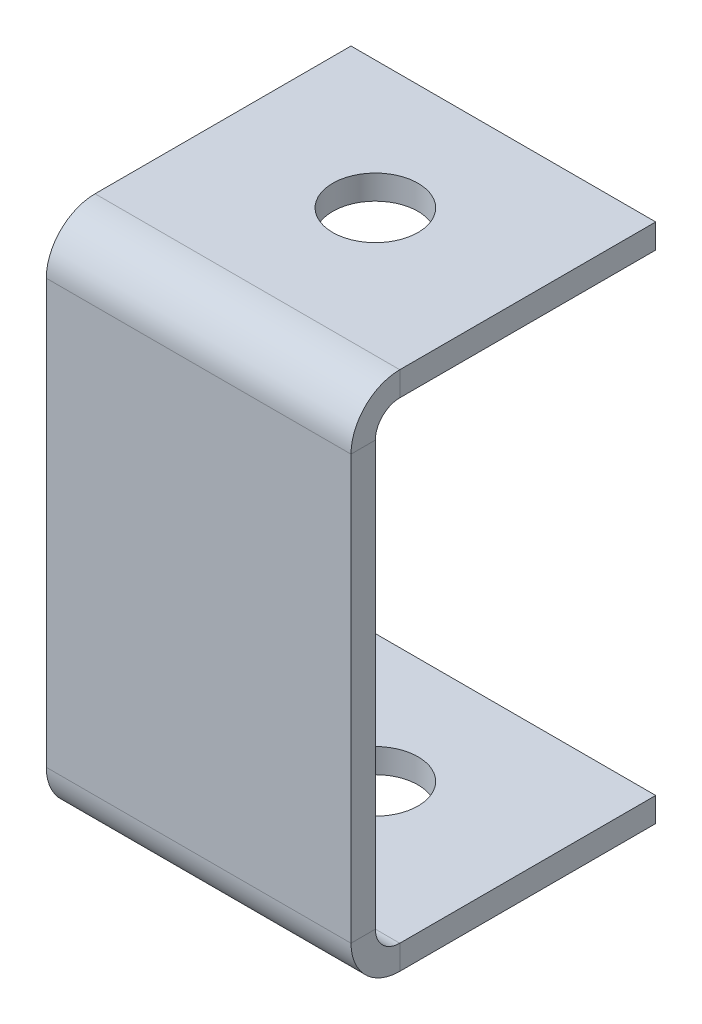
ISO-10303-21;
HEADER;
FILE_DESCRIPTION(('STEP AP214'),'2;1');
FILE_NAME('part.step','',(''),(''),'','','');
FILE_SCHEMA(('AUTOMOTIVE_DESIGN { 1 0 10303 214 1 1 1 1 }'));
ENDSEC;
DATA;
#1=APPLICATION_CONTEXT('core data for automotive mechanical design processes');
#2=APPLICATION_PROTOCOL_DEFINITION('international standard','automotive_design',2000,#1);
#3=PRODUCT_CONTEXT('',#1,'mechanical');
#4=PRODUCT('Part','Part','',(#3));
#5=PRODUCT_RELATED_PRODUCT_CATEGORY('part','',(#4));
#6=PRODUCT_DEFINITION_FORMATION('','',#4);
#7=PRODUCT_DEFINITION_CONTEXT('part definition',#1,'design');
#8=PRODUCT_DEFINITION('design','',#6,#7);
#9=PRODUCT_DEFINITION_SHAPE('','',#8);
#10=(LENGTH_UNIT() NAMED_UNIT(*) SI_UNIT(.MILLI.,.METRE.));
#11=(NAMED_UNIT(*) PLANE_ANGLE_UNIT() SI_UNIT($,.RADIAN.));
#12=(NAMED_UNIT(*) SI_UNIT($,.STERADIAN.) SOLID_ANGLE_UNIT());
#13=UNCERTAINTY_MEASURE_WITH_UNIT(LENGTH_MEASURE(1.E-05),#10,'distance_accuracy_value','');
#14=(GEOMETRIC_REPRESENTATION_CONTEXT(3) GLOBAL_UNCERTAINTY_ASSIGNED_CONTEXT((#13)) GLOBAL_UNIT_ASSIGNED_CONTEXT((#10,
#11,#12)) REPRESENTATION_CONTEXT('',''));
#15=CARTESIAN_POINT('',(0.,0.,0.));
#16=DIRECTION('',(0.,0.,1.));
#17=DIRECTION('',(1.,0.,0.));
#18=AXIS2_PLACEMENT_3D('',#15,#16,#17);
#19=CARTESIAN_POINT('',(0.,0.,-2.));
#20=DIRECTION('',(0.,0.,1.));
#21=DIRECTION('',(1.,0.,0.));
#22=AXIS2_PLACEMENT_3D('',#19,#20,#21);
#23=PLANE('',#22);
#24=DIRECTION('',(1.,0.,0.));
#25=VECTOR('',#24,1.);
#26=CARTESIAN_POINT('',(12.5,17.375,-1.99999999999999));
#27=LINE('',#26,#25);
#28=CARTESIAN_POINT('',(12.5,17.375,-1.99999999999999));
#29=VERTEX_POINT('',#28);
#30=CARTESIAN_POINT('',(-12.5,17.375,-1.99999999999999));
#31=VERTEX_POINT('',#30);
#32=EDGE_CURVE('E326',#29,#31,#27,.F.);
#33=ORIENTED_EDGE('',*,*,#32,.F.);
#34=DIRECTION('',(0.,1.,0.));
#35=VECTOR('',#34,1.);
#36=CARTESIAN_POINT('',(12.5,-21.375,-2.));
#37=LINE('',#36,#35);
#38=CARTESIAN_POINT('',(12.5,-17.375,-1.99999999999999));
#39=VERTEX_POINT('',#38);
#40=EDGE_CURVE('E13',#39,#29,#37,.T.);
#41=ORIENTED_EDGE('',*,*,#40,.F.);
#42=DIRECTION('',(-1.,0.,0.));
#43=VECTOR('',#42,1.);
#44=CARTESIAN_POINT('',(-12.5,-17.375,-1.99999999999999));
#45=LINE('',#44,#43);
#46=CARTESIAN_POINT('',(-12.5,-17.375,-1.99999999999999));
#47=VERTEX_POINT('',#46);
#48=EDGE_CURVE('E146',#47,#39,#45,.F.);
#49=ORIENTED_EDGE('',*,*,#48,.F.);
#50=DIRECTION('',(0.,-1.,0.));
#51=VECTOR('',#50,1.);
#52=CARTESIAN_POINT('',(-12.5,-21.375,-2.));
#53=LINE('',#52,#51);
#54=EDGE_CURVE('E87',#31,#47,#53,.T.);
#55=ORIENTED_EDGE('',*,*,#54,.F.);
#56=EDGE_LOOP('',(#33,#41,#49,#55));
#57=FACE_BOUND('',#56,.T.);
#58=ADVANCED_FACE('F78',(#57),#23,.F.);
#59=CARTESIAN_POINT('',(0.,0.,0.));
#60=DIRECTION('',(0.,0.,1.));
#61=DIRECTION('',(1.,0.,0.));
#62=AXIS2_PLACEMENT_3D('',#59,#60,#61);
#63=PLANE('',#62);
#64=DIRECTION('',(0.,1.,0.));
#65=VECTOR('',#64,1.);
#66=CARTESIAN_POINT('',(12.5,-21.375,0.));
#67=LINE('',#66,#65);
#68=CARTESIAN_POINT('',(12.5,-17.375,0.));
#69=VERTEX_POINT('',#68);
#70=CARTESIAN_POINT('',(12.5,17.375,0.));
#71=VERTEX_POINT('',#70);
#72=EDGE_CURVE('E82',#69,#71,#67,.T.);
#73=ORIENTED_EDGE('',*,*,#72,.T.);
#74=DIRECTION('',(1.,0.,0.));
#75=VECTOR('',#74,1.);
#76=CARTESIAN_POINT('',(12.5,17.375,0.));
#77=LINE('',#76,#75);
#78=CARTESIAN_POINT('',(-12.5,17.375,0.));
#79=VERTEX_POINT('',#78);
#80=EDGE_CURVE('E189',#71,#79,#77,.F.);
#81=ORIENTED_EDGE('',*,*,#80,.T.);
#82=DIRECTION('',(0.,-1.,0.));
#83=VECTOR('',#82,1.);
#84=CARTESIAN_POINT('',(-12.5,-21.375,0.));
#85=LINE('',#84,#83);
#86=CARTESIAN_POINT('',(-12.5,-17.375,0.));
#87=VERTEX_POINT('',#86);
#88=EDGE_CURVE('E104',#79,#87,#85,.T.);
#89=ORIENTED_EDGE('',*,*,#88,.T.);
#90=DIRECTION('',(-1.,0.,0.));
#91=VECTOR('',#90,1.);
#92=CARTESIAN_POINT('',(-12.5,-17.375,0.));
#93=LINE('',#92,#91);
#94=EDGE_CURVE('E173',#87,#69,#93,.F.);
#95=ORIENTED_EDGE('',*,*,#94,.T.);
#96=EDGE_LOOP('',(#73,#81,#89,#95));
#97=FACE_BOUND('',#96,.T.);
#98=ADVANCED_FACE('F186',(#97),#63,.T.);
#99=CARTESIAN_POINT('',(12.5,-21.375,-2.));
#100=DIRECTION('',(1.,0.,0.));
#101=DIRECTION('',(0.,0.,-1.));
#102=AXIS2_PLACEMENT_3D('',#99,#100,#101);
#103=PLANE('',#102);
#104=ORIENTED_EDGE('',*,*,#40,.T.);
#105=DIRECTION('',(0.,0.,1.));
#106=VECTOR('',#105,1.);
#107=CARTESIAN_POINT('',(12.5,17.375,-1.99999999999999));
#108=LINE('',#107,#106);
#109=EDGE_CURVE('E198',#29,#71,#108,.T.);
#110=ORIENTED_EDGE('',*,*,#109,.T.);
#111=ORIENTED_EDGE('',*,*,#72,.F.);
#112=DIRECTION('',(0.,0.,1.));
#113=VECTOR('',#112,1.);
#114=CARTESIAN_POINT('',(12.5,-17.375,-1.99999999999999));
#115=LINE('',#114,#113);
#116=EDGE_CURVE('E180',#39,#69,#115,.T.);
#117=ORIENTED_EDGE('',*,*,#116,.F.);
#118=EDGE_LOOP('',(#104,#110,#111,#117));
#119=FACE_BOUND('',#118,.T.);
#120=ADVANCED_FACE('F195',(#119),#103,.T.);
#121=CARTESIAN_POINT('',(-12.5,-21.375,-2.));
#122=DIRECTION('',(-1.,0.,0.));
#123=DIRECTION('',(0.,0.,1.));
#124=AXIS2_PLACEMENT_3D('',#121,#122,#123);
#125=PLANE('',#124);
#126=DIRECTION('',(0.,0.,1.));
#127=VECTOR('',#126,1.);
#128=CARTESIAN_POINT('',(-12.5,17.375,-1.99999999999999));
#129=LINE('',#128,#127);
#130=EDGE_CURVE('E204',#31,#79,#129,.T.);
#131=ORIENTED_EDGE('',*,*,#130,.F.);
#132=ORIENTED_EDGE('',*,*,#54,.T.);
#133=DIRECTION('',(0.,0.,1.));
#134=VECTOR('',#133,1.);
#135=CARTESIAN_POINT('',(-12.5,-17.375,-1.99999999999999));
#136=LINE('',#135,#134);
#137=EDGE_CURVE('E145',#47,#87,#136,.T.);
#138=ORIENTED_EDGE('',*,*,#137,.T.);
#139=ORIENTED_EDGE('',*,*,#88,.F.);
#140=EDGE_LOOP('',(#131,#132,#138,#139));
#141=FACE_BOUND('',#140,.T.);
#142=ADVANCED_FACE('F80',(#141),#125,.T.);
#143=CARTESIAN_POINT('',(12.5,-17.375,-4.));
#144=DIRECTION('',(1.,0.,0.));
#145=DIRECTION('',(0.,0.,-1.));
#146=AXIS2_PLACEMENT_3D('',#143,#144,#145);
#147=PLANE('',#146);
#148=DIRECTION('',(0.,-1.,0.));
#149=VECTOR('',#148,1.);
#150=CARTESIAN_POINT('',(12.5,-21.375,-3.99999999999998));
#151=LINE('',#150,#149);
#152=CARTESIAN_POINT('',(12.5,-19.375,-3.99999999999999));
#153=VERTEX_POINT('',#152);
#154=CARTESIAN_POINT('',(12.5,-21.375,-3.99999999999998));
#155=VERTEX_POINT('',#154);
#156=EDGE_CURVE('E135',#153,#155,#151,.T.);
#157=ORIENTED_EDGE('',*,*,#156,.F.);
#158=CARTESIAN_POINT('',(12.5,-17.375,-4.));
#159=DIRECTION('',(-1.,0.,0.));
#160=DIRECTION('',(0.,0.,1.));
#161=AXIS2_PLACEMENT_3D('',#158,#159,#160);
#162=CIRCLE('',#161,2.);
#163=EDGE_CURVE('E129',#39,#153,#162,.F.);
#164=ORIENTED_EDGE('',*,*,#163,.F.);
#165=ORIENTED_EDGE('',*,*,#116,.T.);
#166=CARTESIAN_POINT('',(12.5,-17.375,-4.));
#167=DIRECTION('',(-1.,0.,0.));
#168=DIRECTION('',(0.,0.,1.));
#169=AXIS2_PLACEMENT_3D('',#166,#167,#168);
#170=CIRCLE('',#169,4.);
#171=EDGE_CURVE('E95',#69,#155,#170,.F.);
#172=ORIENTED_EDGE('',*,*,#171,.T.);
#173=EDGE_LOOP('',(#157,#164,#165,#172));
#174=FACE_BOUND('',#173,.T.);
#175=ADVANCED_FACE('F368',(#174),#147,.T.);
#176=CARTESIAN_POINT('',(-12.5,-17.375,-4.));
#177=DIRECTION('',(1.,0.,0.));
#178=DIRECTION('',(0.,0.,-1.));
#179=AXIS2_PLACEMENT_3D('',#176,#177,#178);
#180=PLANE('',#179);
#181=CARTESIAN_POINT('',(-12.5,-17.375,-4.));
#182=DIRECTION('',(-1.,0.,0.));
#183=DIRECTION('',(0.,0.,1.));
#184=AXIS2_PLACEMENT_3D('',#181,#182,#183);
#185=CIRCLE('',#184,2.);
#186=CARTESIAN_POINT('',(-12.5,-19.375,-3.99999999999999));
#187=VERTEX_POINT('',#186);
#188=EDGE_CURVE('E126',#187,#47,#185,.T.);
#189=ORIENTED_EDGE('',*,*,#188,.F.);
#190=DIRECTION('',(0.,-1.,0.));
#191=VECTOR('',#190,1.);
#192=CARTESIAN_POINT('',(-12.5,-19.375,-3.99999999999999));
#193=LINE('',#192,#191);
#194=CARTESIAN_POINT('',(-12.5,-21.375,-3.99999999999998));
#195=VERTEX_POINT('',#194);
#196=EDGE_CURVE('E134',#187,#195,#193,.T.);
#197=ORIENTED_EDGE('',*,*,#196,.T.);
#198=CARTESIAN_POINT('',(-12.5,-17.375,-4.));
#199=DIRECTION('',(-1.,0.,0.));
#200=DIRECTION('',(0.,0.,1.));
#201=AXIS2_PLACEMENT_3D('',#198,#199,#200);
#202=CIRCLE('',#201,4.);
#203=EDGE_CURVE('E175',#195,#87,#202,.T.);
#204=ORIENTED_EDGE('',*,*,#203,.T.);
#205=ORIENTED_EDGE('',*,*,#137,.F.);
#206=EDGE_LOOP('',(#189,#197,#204,#205));
#207=FACE_BOUND('',#206,.T.);
#208=ADVANCED_FACE('F140',(#207),#180,.F.);
#209=CARTESIAN_POINT('',(-12.5,-17.375,-4.));
#210=DIRECTION('',(-1.,0.,0.));
#211=DIRECTION('',(0.,-1.,0.));
#212=AXIS2_PLACEMENT_3D('',#209,#210,#211);
#213=CYLINDRICAL_SURFACE('',#212,4.);
#214=ORIENTED_EDGE('',*,*,#94,.F.);
#215=ORIENTED_EDGE('',*,*,#203,.F.);
#216=DIRECTION('',(-1.,0.,0.));
#217=VECTOR('',#216,1.);
#218=CARTESIAN_POINT('',(0.,-21.375,-3.99999999999998));
#219=LINE('',#218,#217);
#220=EDGE_CURVE('E164',#155,#195,#219,.T.);
#221=ORIENTED_EDGE('',*,*,#220,.F.);
#222=ORIENTED_EDGE('',*,*,#171,.F.);
#223=EDGE_LOOP('',(#214,#215,#221,#222));
#224=FACE_BOUND('',#223,.T.);
#225=ADVANCED_FACE('F380',(#224),#213,.T.);
#226=CARTESIAN_POINT('',(-12.5,-17.375,-4.));
#227=DIRECTION('',(-1.,0.,0.));
#228=DIRECTION('',(0.,-1.,0.));
#229=AXIS2_PLACEMENT_3D('',#226,#227,#228);
#230=CYLINDRICAL_SURFACE('',#229,2.);
#231=ORIENTED_EDGE('',*,*,#48,.T.);
#232=ORIENTED_EDGE('',*,*,#163,.T.);
#233=DIRECTION('',(1.,0.,0.));
#234=VECTOR('',#233,1.);
#235=CARTESIAN_POINT('',(12.5,-19.375,-3.99999999999999));
#236=LINE('',#235,#234);
#237=EDGE_CURVE('E123',#153,#187,#236,.F.);
#238=ORIENTED_EDGE('',*,*,#237,.T.);
#239=ORIENTED_EDGE('',*,*,#188,.T.);
#240=EDGE_LOOP('',(#231,#232,#238,#239));
#241=FACE_BOUND('',#240,.T.);
#242=ADVANCED_FACE('F125',(#241),#230,.F.);
#243=CARTESIAN_POINT('',(-12.5,-21.375,-1.99999999999999));
#244=DIRECTION('',(-1.,0.,0.));
#245=DIRECTION('',(0.,0.,1.));
#246=AXIS2_PLACEMENT_3D('',#243,#244,#245);
#247=PLANE('',#246);
#248=DIRECTION('',(0.,0.,1.));
#249=VECTOR('',#248,1.);
#250=CARTESIAN_POINT('',(-12.5,-21.375,-1.99999999999999));
#251=LINE('',#250,#249);
#252=CARTESIAN_POINT('',(-12.5,-21.3750000000001,-25.));
#253=VERTEX_POINT('',#252);
#254=EDGE_CURVE('E163',#253,#195,#251,.T.);
#255=ORIENTED_EDGE('',*,*,#254,.T.);
#256=ORIENTED_EDGE('',*,*,#196,.F.);
#257=DIRECTION('',(0.,0.,-1.));
#258=VECTOR('',#257,1.);
#259=CARTESIAN_POINT('',(-12.5,-19.375,0.));
#260=LINE('',#259,#258);
#261=CARTESIAN_POINT('',(-12.5,-19.3750000000001,-25.));
#262=VERTEX_POINT('',#261);
#263=EDGE_CURVE('E151',#262,#187,#260,.F.);
#264=ORIENTED_EDGE('',*,*,#263,.F.);
#265=DIRECTION('',(0.,1.,0.));
#266=VECTOR('',#265,1.);
#267=CARTESIAN_POINT('',(-12.5,-21.3750000000001,-25.));
#268=LINE('',#267,#266);
#269=EDGE_CURVE('E147',#253,#262,#268,.T.);
#270=ORIENTED_EDGE('',*,*,#269,.F.);
#271=EDGE_LOOP('',(#255,#256,#264,#270));
#272=FACE_BOUND('',#271,.T.);
#273=ADVANCED_FACE('F161',(#272),#247,.T.);
#274=CARTESIAN_POINT('',(12.5,-21.3750000000001,-25.));
#275=DIRECTION('',(1.,0.,0.));
#276=DIRECTION('',(0.,0.,-1.));
#277=AXIS2_PLACEMENT_3D('',#274,#275,#276);
#278=PLANE('',#277);
#279=DIRECTION('',(0.,0.,1.));
#280=VECTOR('',#279,1.);
#281=CARTESIAN_POINT('',(12.5,-19.375,0.));
#282=LINE('',#281,#280);
#283=CARTESIAN_POINT('',(12.5,-19.3750000000001,-25.));
#284=VERTEX_POINT('',#283);
#285=EDGE_CURVE('E166',#153,#284,#282,.F.);
#286=ORIENTED_EDGE('',*,*,#285,.F.);
#287=ORIENTED_EDGE('',*,*,#156,.T.);
#288=DIRECTION('',(0.,0.,-1.));
#289=VECTOR('',#288,1.);
#290=CARTESIAN_POINT('',(12.5,-21.3750000000001,-25.));
#291=LINE('',#290,#289);
#292=CARTESIAN_POINT('',(12.5,-21.3750000000001,-25.));
#293=VERTEX_POINT('',#292);
#294=EDGE_CURVE('E158',#155,#293,#291,.T.);
#295=ORIENTED_EDGE('',*,*,#294,.T.);
#296=DIRECTION('',(0.,1.,0.));
#297=VECTOR('',#296,1.);
#298=CARTESIAN_POINT('',(12.5,-21.3750000000001,-25.));
#299=LINE('',#298,#297);
#300=EDGE_CURVE('E220',#293,#284,#299,.T.);
#301=ORIENTED_EDGE('',*,*,#300,.T.);
#302=EDGE_LOOP('',(#286,#287,#295,#301));
#303=FACE_BOUND('',#302,.T.);
#304=ADVANCED_FACE('F232',(#303),#278,.T.);
#305=CARTESIAN_POINT('',(0.,-21.375,0.));
#306=DIRECTION('',(0.,-1.,0.));
#307=DIRECTION('',(0.,0.,-1.));
#308=AXIS2_PLACEMENT_3D('',#305,#306,#307);
#309=PLANE('',#308);
#310=CARTESIAN_POINT('',(0.,-21.3750000000001,-14.5));
#311=DIRECTION('',(0.,1.,0.));
#312=DIRECTION('',(0.,0.,1.));
#313=AXIS2_PLACEMENT_3D('',#310,#311,#312);
#314=CIRCLE('',#313,3.5);
#315=CARTESIAN_POINT('',(0.,-21.3750000000001,-11.));
#316=VERTEX_POINT('',#315);
#317=EDGE_CURVE('E172',#316,#316,#314,.T.);
#318=ORIENTED_EDGE('',*,*,#317,.T.);
#319=EDGE_LOOP('',(#318));
#320=FACE_BOUND('',#319,.T.);
#321=ORIENTED_EDGE('',*,*,#294,.F.);
#322=ORIENTED_EDGE('',*,*,#220,.T.);
#323=ORIENTED_EDGE('',*,*,#254,.F.);
#324=DIRECTION('',(-1.,0.,0.));
#325=VECTOR('',#324,1.);
#326=CARTESIAN_POINT('',(-12.5,-21.3750000000001,-25.));
#327=LINE('',#326,#325);
#328=EDGE_CURVE('E224',#293,#253,#327,.T.);
#329=ORIENTED_EDGE('',*,*,#328,.F.);
#330=EDGE_LOOP('',(#321,#322,#323,#329));
#331=FACE_BOUND('',#330,.T.);
#332=ADVANCED_FACE('F379',(#320,#331),#309,.T.);
#333=CARTESIAN_POINT('',(0.,-19.375,0.));
#334=DIRECTION('',(0.,-1.,0.));
#335=DIRECTION('',(0.,0.,-1.));
#336=AXIS2_PLACEMENT_3D('',#333,#334,#335);
#337=PLANE('',#336);
#338=CARTESIAN_POINT('',(0.,-19.375,-14.5));
#339=DIRECTION('',(0.,1.,0.));
#340=DIRECTION('',(0.,0.,1.));
#341=AXIS2_PLACEMENT_3D('',#338,#339,#340);
#342=CIRCLE('',#341,3.5);
#343=CARTESIAN_POINT('',(0.,-19.375,-11.));
#344=VERTEX_POINT('',#343);
#345=EDGE_CURVE('E208',#344,#344,#342,.T.);
#346=ORIENTED_EDGE('',*,*,#345,.F.);
#347=EDGE_LOOP('',(#346));
#348=FACE_BOUND('',#347,.T.);
#349=ORIENTED_EDGE('',*,*,#237,.F.);
#350=ORIENTED_EDGE('',*,*,#285,.T.);
#351=DIRECTION('',(1.,0.,0.));
#352=VECTOR('',#351,1.);
#353=CARTESIAN_POINT('',(0.,-19.3750000000001,-25.));
#354=LINE('',#353,#352);
#355=EDGE_CURVE('E155',#284,#262,#354,.F.);
#356=ORIENTED_EDGE('',*,*,#355,.T.);
#357=ORIENTED_EDGE('',*,*,#263,.T.);
#358=EDGE_LOOP('',(#349,#350,#356,#357));
#359=FACE_BOUND('',#358,.T.);
#360=ADVANCED_FACE('F152',(#348,#359),#337,.F.);
#361=CARTESIAN_POINT('',(-12.5,-21.3750000000001,-25.));
#362=DIRECTION('',(0.,0.,-1.));
#363=DIRECTION('',(0.,1.,0.));
#364=AXIS2_PLACEMENT_3D('',#361,#362,#363);
#365=PLANE('',#364);
#366=ORIENTED_EDGE('',*,*,#355,.F.);
#367=ORIENTED_EDGE('',*,*,#300,.F.);
#368=ORIENTED_EDGE('',*,*,#328,.T.);
#369=ORIENTED_EDGE('',*,*,#269,.T.);
#370=EDGE_LOOP('',(#366,#367,#368,#369));
#371=FACE_BOUND('',#370,.T.);
#372=ADVANCED_FACE('F237',(#371),#365,.T.);
#373=CARTESIAN_POINT('',(0.,-21.3750000000001,-14.5));
#374=DIRECTION('',(0.,1.,0.));
#375=DIRECTION('',(0.,0.,1.));
#376=AXIS2_PLACEMENT_3D('',#373,#374,#375);
#377=CYLINDRICAL_SURFACE('',#376,3.5);
#378=ORIENTED_EDGE('',*,*,#317,.F.);
#379=EDGE_LOOP('',(#378));
#380=FACE_BOUND('',#379,.T.);
#381=ORIENTED_EDGE('',*,*,#345,.T.);
#382=EDGE_LOOP('',(#381));
#383=FACE_BOUND('',#382,.T.);
#384=ADVANCED_FACE('F393',(#380,#383),#377,.F.);
#385=CARTESIAN_POINT('',(-12.5,17.375,-4.));
#386=DIRECTION('',(-1.,0.,0.));
#387=DIRECTION('',(0.,0.,1.));
#388=AXIS2_PLACEMENT_3D('',#385,#386,#387);
#389=PLANE('',#388);
#390=DIRECTION('',(0.,-1.,0.));
#391=VECTOR('',#390,1.);
#392=CARTESIAN_POINT('',(-12.5,21.375,-3.99999999999998));
#393=LINE('',#392,#391);
#394=CARTESIAN_POINT('',(-12.5,19.375,-3.99999999999999));
#395=VERTEX_POINT('',#394);
#396=CARTESIAN_POINT('',(-12.5,21.375,-3.99999999999998));
#397=VERTEX_POINT('',#396);
#398=EDGE_CURVE('E319',#395,#397,#393,.F.);
#399=ORIENTED_EDGE('',*,*,#398,.F.);
#400=CARTESIAN_POINT('',(-12.5,17.375,-4.));
#401=DIRECTION('',(1.,0.,0.));
#402=DIRECTION('',(0.,0.,-1.));
#403=AXIS2_PLACEMENT_3D('',#400,#401,#402);
#404=CIRCLE('',#403,2.);
#405=EDGE_CURVE('E279',#31,#395,#404,.F.);
#406=ORIENTED_EDGE('',*,*,#405,.F.);
#407=ORIENTED_EDGE('',*,*,#130,.T.);
#408=CARTESIAN_POINT('',(-12.5,17.375,-4.));
#409=DIRECTION('',(1.,0.,0.));
#410=DIRECTION('',(0.,0.,-1.));
#411=AXIS2_PLACEMENT_3D('',#408,#409,#410);
#412=CIRCLE('',#411,4.);
#413=EDGE_CURVE('E205',#79,#397,#412,.F.);
#414=ORIENTED_EDGE('',*,*,#413,.T.);
#415=EDGE_LOOP('',(#399,#406,#407,#414));
#416=FACE_BOUND('',#415,.T.);
#417=ADVANCED_FACE('F404',(#416),#389,.T.);
#418=CARTESIAN_POINT('',(12.5,17.375,-4.));
#419=DIRECTION('',(-1.,0.,0.));
#420=DIRECTION('',(0.,0.,1.));
#421=AXIS2_PLACEMENT_3D('',#418,#419,#420);
#422=PLANE('',#421);
#423=CARTESIAN_POINT('',(12.5,17.375,-4.));
#424=DIRECTION('',(1.,0.,0.));
#425=DIRECTION('',(0.,0.,-1.));
#426=AXIS2_PLACEMENT_3D('',#423,#424,#425);
#427=CIRCLE('',#426,2.);
#428=CARTESIAN_POINT('',(12.5,19.375,-3.99999999999999));
#429=VERTEX_POINT('',#428);
#430=EDGE_CURVE('E284',#429,#29,#427,.T.);
#431=ORIENTED_EDGE('',*,*,#430,.F.);
#432=DIRECTION('',(0.,-1.,0.));
#433=VECTOR('',#432,1.);
#434=CARTESIAN_POINT('',(12.5,19.375,-3.99999999999999));
#435=LINE('',#434,#433);
#436=CARTESIAN_POINT('',(12.5,21.375,-3.99999999999998));
#437=VERTEX_POINT('',#436);
#438=EDGE_CURVE('E282',#429,#437,#435,.F.);
#439=ORIENTED_EDGE('',*,*,#438,.T.);
#440=CARTESIAN_POINT('',(12.5,17.375,-4.));
#441=DIRECTION('',(1.,0.,0.));
#442=DIRECTION('',(0.,0.,-1.));
#443=AXIS2_PLACEMENT_3D('',#440,#441,#442);
#444=CIRCLE('',#443,4.);
#445=EDGE_CURVE('E274',#437,#71,#444,.T.);
#446=ORIENTED_EDGE('',*,*,#445,.T.);
#447=ORIENTED_EDGE('',*,*,#109,.F.);
#448=EDGE_LOOP('',(#431,#439,#446,#447));
#449=FACE_BOUND('',#448,.T.);
#450=ADVANCED_FACE('F283',(#449),#422,.F.);
#451=CARTESIAN_POINT('',(12.5,17.375,-4.));
#452=DIRECTION('',(1.,0.,0.));
#453=DIRECTION('',(0.,1.,0.));
#454=AXIS2_PLACEMENT_3D('',#451,#452,#453);
#455=CYLINDRICAL_SURFACE('',#454,4.);
#456=ORIENTED_EDGE('',*,*,#80,.F.);
#457=ORIENTED_EDGE('',*,*,#445,.F.);
#458=DIRECTION('',(1.,0.,0.));
#459=VECTOR('',#458,1.);
#460=CARTESIAN_POINT('',(0.,21.375,-3.99999999999998));
#461=LINE('',#460,#459);
#462=EDGE_CURVE('E278',#397,#437,#461,.T.);
#463=ORIENTED_EDGE('',*,*,#462,.F.);
#464=ORIENTED_EDGE('',*,*,#413,.F.);
#465=EDGE_LOOP('',(#456,#457,#463,#464));
#466=FACE_BOUND('',#465,.T.);
#467=ADVANCED_FACE('F276',(#466),#455,.T.);
#468=CARTESIAN_POINT('',(12.5,17.375,-4.));
#469=DIRECTION('',(1.,0.,0.));
#470=DIRECTION('',(0.,1.,0.));
#471=AXIS2_PLACEMENT_3D('',#468,#469,#470);
#472=CYLINDRICAL_SURFACE('',#471,2.);
#473=ORIENTED_EDGE('',*,*,#32,.T.);
#474=ORIENTED_EDGE('',*,*,#405,.T.);
#475=DIRECTION('',(-1.,0.,0.));
#476=VECTOR('',#475,1.);
#477=CARTESIAN_POINT('',(-12.5,19.375,-3.99999999999999));
#478=LINE('',#477,#476);
#479=EDGE_CURVE('E288',#395,#429,#478,.F.);
#480=ORIENTED_EDGE('',*,*,#479,.T.);
#481=ORIENTED_EDGE('',*,*,#430,.T.);
#482=EDGE_LOOP('',(#473,#474,#480,#481));
#483=FACE_BOUND('',#482,.T.);
#484=ADVANCED_FACE('F410',(#483),#472,.F.);
#485=CARTESIAN_POINT('',(12.5,21.3750000000001,-25.));
#486=DIRECTION('',(-1.,0.,0.));
#487=DIRECTION('',(0.,0.,1.));
#488=AXIS2_PLACEMENT_3D('',#485,#486,#487);
#489=PLANE('',#488);
#490=ORIENTED_EDGE('',*,*,#438,.F.);
#491=DIRECTION('',(0.,0.,-1.));
#492=VECTOR('',#491,1.);
#493=CARTESIAN_POINT('',(12.5,19.3750000000001,-25.));
#494=LINE('',#493,#492);
#495=CARTESIAN_POINT('',(12.5,19.3750000000001,-25.));
#496=VERTEX_POINT('',#495);
#497=EDGE_CURVE('E312',#429,#496,#494,.T.);
#498=ORIENTED_EDGE('',*,*,#497,.T.);
#499=DIRECTION('',(0.,-1.,0.));
#500=VECTOR('',#499,1.);
#501=CARTESIAN_POINT('',(12.5,21.3750000000001,-25.));
#502=LINE('',#501,#500);
#503=CARTESIAN_POINT('',(12.5,21.3750000000001,-25.));
#504=VERTEX_POINT('',#503);
#505=EDGE_CURVE('E301',#504,#496,#502,.T.);
#506=ORIENTED_EDGE('',*,*,#505,.F.);
#507=DIRECTION('',(0.,0.,1.));
#508=VECTOR('',#507,1.);
#509=CARTESIAN_POINT('',(12.5,21.375,0.));
#510=LINE('',#509,#508);
#511=EDGE_CURVE('E293',#437,#504,#510,.F.);
#512=ORIENTED_EDGE('',*,*,#511,.F.);
#513=EDGE_LOOP('',(#490,#498,#506,#512));
#514=FACE_BOUND('',#513,.T.);
#515=ADVANCED_FACE('F299',(#514),#489,.F.);
#516=CARTESIAN_POINT('',(-12.5,21.375,-1.99999999999999));
#517=DIRECTION('',(1.,0.,0.));
#518=DIRECTION('',(0.,0.,-1.));
#519=AXIS2_PLACEMENT_3D('',#516,#517,#518);
#520=PLANE('',#519);
#521=ORIENTED_EDGE('',*,*,#398,.T.);
#522=DIRECTION('',(0.,0.,-1.));
#523=VECTOR('',#522,1.);
#524=CARTESIAN_POINT('',(-12.5,21.375,0.));
#525=LINE('',#524,#523);
#526=CARTESIAN_POINT('',(-12.5,21.3750000000001,-25.));
#527=VERTEX_POINT('',#526);
#528=EDGE_CURVE('E296',#527,#397,#525,.F.);
#529=ORIENTED_EDGE('',*,*,#528,.F.);
#530=DIRECTION('',(0.,-1.,0.));
#531=VECTOR('',#530,1.);
#532=CARTESIAN_POINT('',(-12.5,21.3750000000001,-25.));
#533=LINE('',#532,#531);
#534=CARTESIAN_POINT('',(-12.5,19.3750000000001,-25.));
#535=VERTEX_POINT('',#534);
#536=EDGE_CURVE('E303',#527,#535,#533,.T.);
#537=ORIENTED_EDGE('',*,*,#536,.T.);
#538=DIRECTION('',(0.,0.,1.));
#539=VECTOR('',#538,1.);
#540=CARTESIAN_POINT('',(-12.5,19.375,-2.));
#541=LINE('',#540,#539);
#542=EDGE_CURVE('E297',#535,#395,#541,.T.);
#543=ORIENTED_EDGE('',*,*,#542,.T.);
#544=EDGE_LOOP('',(#521,#529,#537,#543));
#545=FACE_BOUND('',#544,.T.);
#546=ADVANCED_FACE('F343',(#545),#520,.F.);
#547=CARTESIAN_POINT('',(0.,21.375,0.));
#548=DIRECTION('',(0.,1.,0.));
#549=DIRECTION('',(0.,0.,-1.));
#550=AXIS2_PLACEMENT_3D('',#547,#548,#549);
#551=PLANE('',#550);
#552=CARTESIAN_POINT('',(0.,21.3750000000001,-14.5));
#553=DIRECTION('',(0.,1.,0.));
#554=DIRECTION('',(0.,0.,1.));
#555=AXIS2_PLACEMENT_3D('',#552,#553,#554);
#556=CIRCLE('',#555,3.5);
#557=CARTESIAN_POINT('',(0.,21.3750000000001,-11.));
#558=VERTEX_POINT('',#557);
#559=EDGE_CURVE('E322',#558,#558,#556,.T.);
#560=ORIENTED_EDGE('',*,*,#559,.F.);
#561=EDGE_LOOP('',(#560));
#562=FACE_BOUND('',#561,.T.);
#563=ORIENTED_EDGE('',*,*,#528,.T.);
#564=ORIENTED_EDGE('',*,*,#462,.T.);
#565=ORIENTED_EDGE('',*,*,#511,.T.);
#566=DIRECTION('',(1.,0.,0.));
#567=VECTOR('',#566,1.);
#568=CARTESIAN_POINT('',(0.,21.3750000000001,-25.));
#569=LINE('',#568,#567);
#570=EDGE_CURVE('E304',#504,#527,#569,.F.);
#571=ORIENTED_EDGE('',*,*,#570,.T.);
#572=EDGE_LOOP('',(#563,#564,#565,#571));
#573=FACE_BOUND('',#572,.T.);
#574=ADVANCED_FACE('F292',(#562,#573),#551,.T.);
#575=CARTESIAN_POINT('',(0.,19.375,0.));
#576=DIRECTION('',(0.,1.,0.));
#577=DIRECTION('',(0.,0.,-1.));
#578=AXIS2_PLACEMENT_3D('',#575,#576,#577);
#579=PLANE('',#578);
#580=CARTESIAN_POINT('',(0.,19.375,-14.5));
#581=DIRECTION('',(0.,1.,0.));
#582=DIRECTION('',(0.,0.,1.));
#583=AXIS2_PLACEMENT_3D('',#580,#581,#582);
#584=CIRCLE('',#583,3.5);
#585=CARTESIAN_POINT('',(0.,19.375,-11.));
#586=VERTEX_POINT('',#585);
#587=EDGE_CURVE('E332',#586,#586,#584,.T.);
#588=ORIENTED_EDGE('',*,*,#587,.T.);
#589=EDGE_LOOP('',(#588));
#590=FACE_BOUND('',#589,.T.);
#591=ORIENTED_EDGE('',*,*,#479,.F.);
#592=ORIENTED_EDGE('',*,*,#542,.F.);
#593=DIRECTION('',(-1.,0.,0.));
#594=VECTOR('',#593,1.);
#595=CARTESIAN_POINT('',(-12.5,19.3750000000001,-25.));
#596=LINE('',#595,#594);
#597=EDGE_CURVE('E314',#496,#535,#596,.T.);
#598=ORIENTED_EDGE('',*,*,#597,.F.);
#599=ORIENTED_EDGE('',*,*,#497,.F.);
#600=EDGE_LOOP('',(#591,#592,#598,#599));
#601=FACE_BOUND('',#600,.T.);
#602=ADVANCED_FACE('F342',(#590,#601),#579,.F.);
#603=CARTESIAN_POINT('',(-12.5,21.3750000000001,-25.));
#604=DIRECTION('',(0.,0.,1.));
#605=DIRECTION('',(0.,-1.,0.));
#606=AXIS2_PLACEMENT_3D('',#603,#604,#605);
#607=PLANE('',#606);
#608=ORIENTED_EDGE('',*,*,#597,.T.);
#609=ORIENTED_EDGE('',*,*,#536,.F.);
#610=ORIENTED_EDGE('',*,*,#570,.F.);
#611=ORIENTED_EDGE('',*,*,#505,.T.);
#612=EDGE_LOOP('',(#608,#609,#610,#611));
#613=FACE_BOUND('',#612,.T.);
#614=ADVANCED_FACE('F349',(#613),#607,.F.);
#615=CARTESIAN_POINT('',(0.,21.3750000000001,-14.5));
#616=DIRECTION('',(0.,-1.,0.));
#617=DIRECTION('',(0.,0.,-1.));
#618=AXIS2_PLACEMENT_3D('',#615,#616,#617);
#619=CYLINDRICAL_SURFACE('',#618,3.5);
#620=ORIENTED_EDGE('',*,*,#559,.T.);
#621=EDGE_LOOP('',(#620));
#622=FACE_BOUND('',#621,.T.);
#623=ORIENTED_EDGE('',*,*,#587,.F.);
#624=EDGE_LOOP('',(#623));
#625=FACE_BOUND('',#624,.T.);
#626=ADVANCED_FACE('F338',(#622,#625),#619,.F.);
#627=CLOSED_SHELL('',(#58,#98,#120,#142,#175,#208,#225,#242,#273,#304,#332,#360,#372,#384,#417,
#450,#467,#484,#515,#546,#574,#602,#614,#626));
#628=MANIFOLD_SOLID_BREP('B2',#627);
#629=ADVANCED_BREP_SHAPE_REPRESENTATION('',(#18,#628),#14);
#630=SHAPE_DEFINITION_REPRESENTATION(#9,#629);
ENDSEC;
END-ISO-10303-21;
